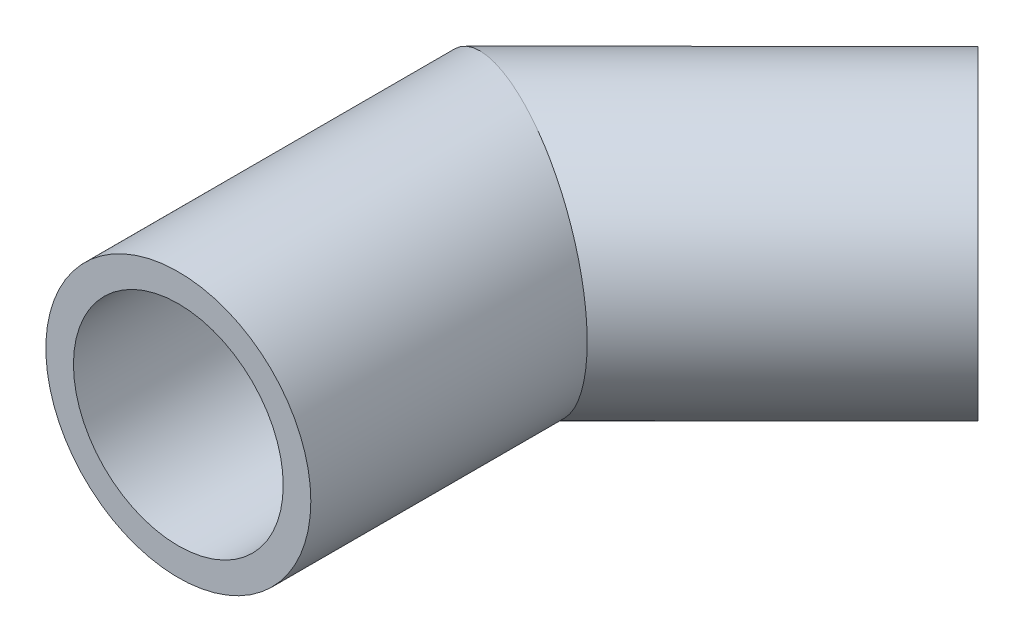
ISO-10303-21;
HEADER;
FILE_DESCRIPTION(('STEP AP214'),'2;1');
FILE_NAME('part.step','',(''),(''),'','','');
FILE_SCHEMA(('AUTOMOTIVE_DESIGN { 1 0 10303 214 1 1 1 1 }'));
ENDSEC;
DATA;
#1=APPLICATION_CONTEXT('core data for automotive mechanical design processes');
#2=APPLICATION_PROTOCOL_DEFINITION('international standard','automotive_design',2000,#1);
#3=PRODUCT_CONTEXT('',#1,'mechanical');
#4=PRODUCT('Part','Part','',(#3));
#5=PRODUCT_RELATED_PRODUCT_CATEGORY('part','',(#4));
#6=PRODUCT_DEFINITION_FORMATION('','',#4);
#7=PRODUCT_DEFINITION_CONTEXT('part definition',#1,'design');
#8=PRODUCT_DEFINITION('design','',#6,#7);
#9=PRODUCT_DEFINITION_SHAPE('','',#8);
#10=(LENGTH_UNIT() NAMED_UNIT(*) SI_UNIT(.MILLI.,.METRE.));
#11=(NAMED_UNIT(*) PLANE_ANGLE_UNIT() SI_UNIT($,.RADIAN.));
#12=(NAMED_UNIT(*) SI_UNIT($,.STERADIAN.) SOLID_ANGLE_UNIT());
#13=UNCERTAINTY_MEASURE_WITH_UNIT(LENGTH_MEASURE(1.E-05),#10,'distance_accuracy_value','');
#14=(GEOMETRIC_REPRESENTATION_CONTEXT(3) GLOBAL_UNCERTAINTY_ASSIGNED_CONTEXT((#13)) GLOBAL_UNIT_ASSIGNED_CONTEXT((#10,
#11,#12)) REPRESENTATION_CONTEXT('',''));
#15=CARTESIAN_POINT('',(0.,0.,0.));
#16=DIRECTION('',(0.,0.,1.));
#17=DIRECTION('',(1.,0.,0.));
#18=AXIS2_PLACEMENT_3D('',#15,#16,#17);
#19=CARTESIAN_POINT('',(0.,0.,-76.2));
#20=DIRECTION('',(0.707106781186549,0.,-0.707106781186546));
#21=DIRECTION('',(-0.707106781186546,0.,-0.707106781186549));
#22=AXIS2_PLACEMENT_3D('',#19,#20,#21);
#23=CYLINDRICAL_SURFACE('',#22,30.48);
#24=CARTESIAN_POINT('',(0.,0.,-76.2));
#25=DIRECTION('',(0.382683432365091,0.,-0.923879532511286));
#26=DIRECTION('',(0.923879532511286,0.,0.382683432365091));
#27=AXIS2_PLACEMENT_3D('',#24,#25,#26);
#28=ELLIPSE('',#27,32.9913142649122,30.48);
#29=CARTESIAN_POINT('',(30.48,0.,-63.574770618868));
#30=VERTEX_POINT('',#29);
#31=EDGE_CURVE('E48',#30,#30,#28,.F.);
#32=ORIENTED_EDGE('',*,*,#31,.F.);
#33=EDGE_LOOP('',(#32));
#34=FACE_BOUND('',#33,.T.);
#35=CARTESIAN_POINT('',(53.881536726415,0.,-130.081536726415));
#36=DIRECTION('',(0.707106781186549,0.,-0.707106781186546));
#37=DIRECTION('',(-0.707106781186546,0.,-0.707106781186549));
#38=AXIS2_PLACEMENT_3D('',#35,#36,#37);
#39=CIRCLE('',#38,30.48);
#40=CARTESIAN_POINT('',(32.3289220358491,0.,-151.634151416981));
#41=VERTEX_POINT('',#40);
#42=EDGE_CURVE('E11',#41,#41,#39,.T.);
#43=ORIENTED_EDGE('',*,*,#42,.F.);
#44=EDGE_LOOP('',(#43));
#45=FACE_BOUND('',#44,.T.);
#46=ADVANCED_FACE('F32',(#34,#45),#23,.T.);
#47=CARTESIAN_POINT('',(0.,0.,-76.2));
#48=DIRECTION('',(0.707106781186549,0.,-0.707106781186546));
#49=DIRECTION('',(-0.707106781186546,0.,-0.707106781186549));
#50=AXIS2_PLACEMENT_3D('',#47,#48,#49);
#51=CYLINDRICAL_SURFACE('',#50,24.13);
#52=CARTESIAN_POINT('',(0.,0.,-76.2));
#53=DIRECTION('',(0.382683432365091,0.,-0.923879532511286));
#54=DIRECTION('',(0.923879532511286,0.,0.382683432365091));
#55=AXIS2_PLACEMENT_3D('',#52,#53,#54);
#56=ELLIPSE('',#55,26.1181237930555,24.13);
#57=CARTESIAN_POINT('',(24.13,0.,-66.2050267399372));
#58=VERTEX_POINT('',#57);
#59=EDGE_CURVE('E44',#58,#58,#56,.F.);
#60=ORIENTED_EDGE('',*,*,#59,.T.);
#61=EDGE_LOOP('',(#60));
#62=FACE_BOUND('',#61,.T.);
#63=CARTESIAN_POINT('',(53.881536726415,0.,-130.081536726415));
#64=DIRECTION('',(0.707106781186549,0.,-0.707106781186546));
#65=DIRECTION('',(-0.707106781186546,0.,-0.707106781186549));
#66=AXIS2_PLACEMENT_3D('',#63,#64,#65);
#67=CIRCLE('',#66,24.13);
#68=CARTESIAN_POINT('',(36.8190500963837,0.,-147.144023356446));
#69=VERTEX_POINT('',#68);
#70=EDGE_CURVE('E36',#69,#69,#67,.T.);
#71=ORIENTED_EDGE('',*,*,#70,.T.);
#72=EDGE_LOOP('',(#71));
#73=FACE_BOUND('',#72,.T.);
#74=ADVANCED_FACE('F34',(#62,#73),#51,.F.);
#75=CARTESIAN_POINT('',(0.,0.,-162.410458762264));
#76=DIRECTION('',(0.,0.,1.));
#77=DIRECTION('',(1.,0.,0.));
#78=AXIS2_PLACEMENT_3D('',#75,#76,#77);
#79=CYLINDRICAL_SURFACE('',#78,24.13);
#80=CARTESIAN_POINT('',(0.,0.,0.));
#81=DIRECTION('',(0.,0.,1.));
#82=DIRECTION('',(1.,0.,0.));
#83=AXIS2_PLACEMENT_3D('',#80,#81,#82);
#84=CIRCLE('',#83,24.13);
#85=CARTESIAN_POINT('',(24.13,0.,0.));
#86=VERTEX_POINT('',#85);
#87=EDGE_CURVE('E49',#86,#86,#84,.T.);
#88=ORIENTED_EDGE('',*,*,#87,.T.);
#89=EDGE_LOOP('',(#88));
#90=FACE_BOUND('',#89,.T.);
#91=ORIENTED_EDGE('',*,*,#59,.F.);
#92=EDGE_LOOP('',(#91));
#93=FACE_BOUND('',#92,.T.);
#94=ADVANCED_FACE('F64',(#90,#93),#79,.F.);
#95=CARTESIAN_POINT('',(0.,0.,0.));
#96=DIRECTION('',(0.,0.,1.));
#97=DIRECTION('',(1.,0.,0.));
#98=AXIS2_PLACEMENT_3D('',#95,#96,#97);
#99=PLANE('',#98);
#100=ORIENTED_EDGE('',*,*,#87,.F.);
#101=EDGE_LOOP('',(#100));
#102=FACE_BOUND('',#101,.T.);
#103=CARTESIAN_POINT('',(0.,0.,0.));
#104=DIRECTION('',(0.,0.,1.));
#105=DIRECTION('',(1.,0.,0.));
#106=AXIS2_PLACEMENT_3D('',#103,#104,#105);
#107=CIRCLE('',#106,30.48);
#108=CARTESIAN_POINT('',(30.48,0.,0.));
#109=VERTEX_POINT('',#108);
#110=EDGE_CURVE('E52',#109,#109,#107,.T.);
#111=ORIENTED_EDGE('',*,*,#110,.T.);
#112=EDGE_LOOP('',(#111));
#113=FACE_BOUND('',#112,.T.);
#114=ADVANCED_FACE('F69',(#102,#113),#99,.T.);
#115=CARTESIAN_POINT('',(0.,0.,-162.410458762264));
#116=DIRECTION('',(0.,0.,1.));
#117=DIRECTION('',(1.,0.,0.));
#118=AXIS2_PLACEMENT_3D('',#115,#116,#117);
#119=CYLINDRICAL_SURFACE('',#118,30.48);
#120=ORIENTED_EDGE('',*,*,#110,.F.);
#121=EDGE_LOOP('',(#120));
#122=FACE_BOUND('',#121,.T.);
#123=ORIENTED_EDGE('',*,*,#31,.T.);
#124=EDGE_LOOP('',(#123));
#125=FACE_BOUND('',#124,.T.);
#126=ADVANCED_FACE('F57',(#122,#125),#119,.T.);
#127=CARTESIAN_POINT('',(53.881536726415,0.,-130.081536726415));
#128=DIRECTION('',(0.707106781186549,0.,-0.707106781186546));
#129=DIRECTION('',(-0.707106781186546,0.,-0.707106781186549));
#130=AXIS2_PLACEMENT_3D('',#127,#128,#129);
#131=PLANE('',#130);
#132=ORIENTED_EDGE('',*,*,#70,.F.);
#133=EDGE_LOOP('',(#132));
#134=FACE_BOUND('',#133,.T.);
#135=ORIENTED_EDGE('',*,*,#42,.T.);
#136=EDGE_LOOP('',(#135));
#137=FACE_BOUND('',#136,.T.);
#138=ADVANCED_FACE('F73',(#134,#137),#131,.T.);
#139=CLOSED_SHELL('',(#46,#74,#94,#114,#126,#138));
#140=MANIFOLD_SOLID_BREP('B2',#139);
#141=ADVANCED_BREP_SHAPE_REPRESENTATION('',(#18,#140),#14);
#142=SHAPE_DEFINITION_REPRESENTATION(#9,#141);
ENDSEC;
END-ISO-10303-21;
